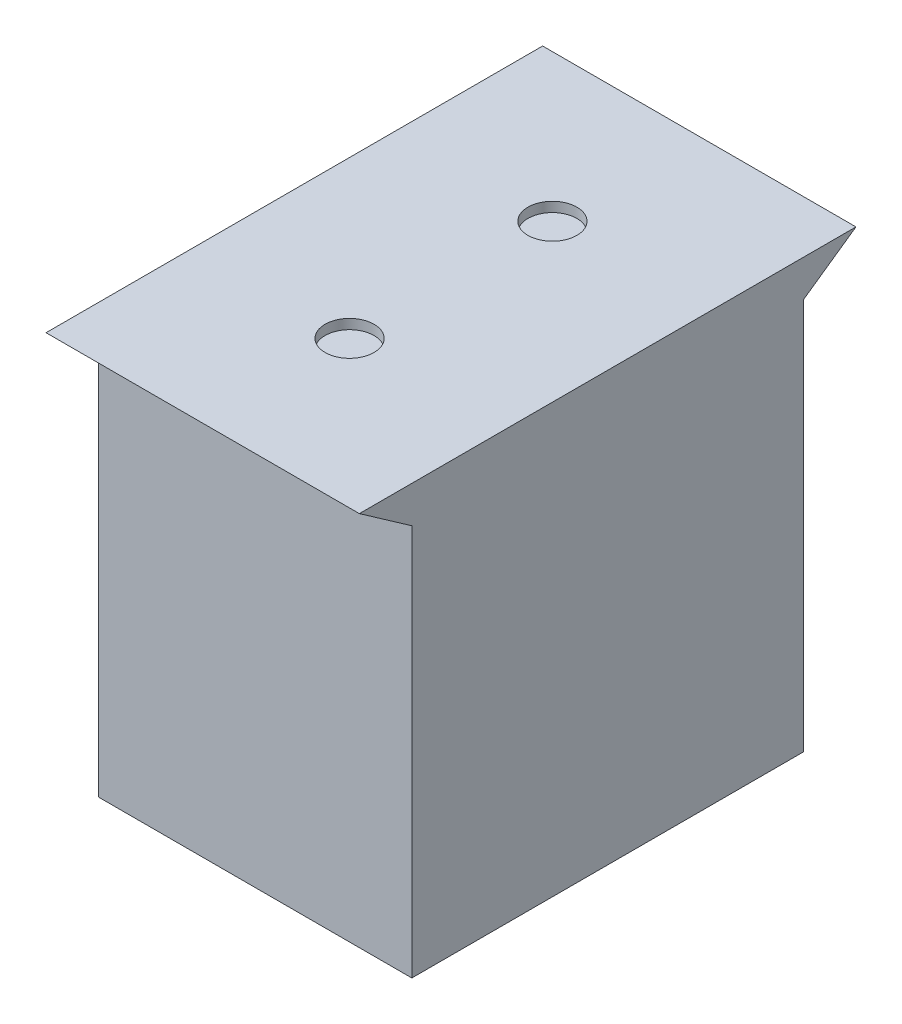
ISO-10303-21;
HEADER;
FILE_DESCRIPTION(('STEP AP214'),'2;1');
FILE_NAME('part.step','',(''),(''),'','','');
FILE_SCHEMA(('AUTOMOTIVE_DESIGN { 1 0 10303 214 1 1 1 1 }'));
ENDSEC;
DATA;
#1=APPLICATION_CONTEXT('core data for automotive mechanical design processes');
#2=APPLICATION_PROTOCOL_DEFINITION('international standard','automotive_design',2000,#1);
#3=PRODUCT_CONTEXT('',#1,'mechanical');
#4=PRODUCT('Part','Part','',(#3));
#5=PRODUCT_RELATED_PRODUCT_CATEGORY('part','',(#4));
#6=PRODUCT_DEFINITION_FORMATION('','',#4);
#7=PRODUCT_DEFINITION_CONTEXT('part definition',#1,'design');
#8=PRODUCT_DEFINITION('design','',#6,#7);
#9=PRODUCT_DEFINITION_SHAPE('','',#8);
#10=(LENGTH_UNIT() NAMED_UNIT(*) SI_UNIT(.MILLI.,.METRE.));
#11=(NAMED_UNIT(*) PLANE_ANGLE_UNIT() SI_UNIT($,.RADIAN.));
#12=(NAMED_UNIT(*) SI_UNIT($,.STERADIAN.) SOLID_ANGLE_UNIT());
#13=UNCERTAINTY_MEASURE_WITH_UNIT(LENGTH_MEASURE(1.E-05),#10,'distance_accuracy_value','');
#14=(GEOMETRIC_REPRESENTATION_CONTEXT(3) GLOBAL_UNCERTAINTY_ASSIGNED_CONTEXT((#13)) GLOBAL_UNIT_ASSIGNED_CONTEXT((#10,
#11,#12)) REPRESENTATION_CONTEXT('',''));
#15=CARTESIAN_POINT('',(0.,0.,0.));
#16=DIRECTION('',(0.,0.,1.));
#17=DIRECTION('',(1.,0.,0.));
#18=AXIS2_PLACEMENT_3D('',#15,#16,#17);
#19=CARTESIAN_POINT('',(8.49073353619236,5.5565366358729,-3.22056484666148));
#20=DIRECTION('',(0.,1.,0.));
#21=DIRECTION('',(0.,0.,1.));
#22=AXIS2_PLACEMENT_3D('',#19,#20,#21);
#23=PLANE('',#22);
#24=CARTESIAN_POINT('',(0.,5.5565366358729,1.31556484666148));
#25=DIRECTION('',(0.,-1.,0.));
#26=DIRECTION('',(0.,0.,-1.));
#27=AXIS2_PLACEMENT_3D('',#24,#25,#26);
#28=CIRCLE('',#27,0.3175);
#29=CARTESIAN_POINT('',(0.,5.5565366358729,0.99806484666148));
#30=VERTEX_POINT('',#29);
#31=EDGE_CURVE('E218',#30,#30,#28,.T.);
#32=ORIENTED_EDGE('',*,*,#31,.T.);
#33=EDGE_LOOP('',(#32));
#34=FACE_BOUND('',#33,.T.);
#35=DIRECTION('',(0.,0.,1.));
#36=VECTOR('',#35,1.);
#37=CARTESIAN_POINT('',(2.032,5.5565366358729,-3.22056484666148));
#38=LINE('',#37,#36);
#39=CARTESIAN_POINT('',(2.032,5.5565366358729,-3.22056484666148));
#40=VERTEX_POINT('',#39);
#41=CARTESIAN_POINT('',(2.032,5.5565366358729,3.22056484666149));
#42=VERTEX_POINT('',#41);
#43=EDGE_CURVE('E147',#40,#42,#38,.T.);
#44=ORIENTED_EDGE('',*,*,#43,.F.);
#45=DIRECTION('',(-1.,0.,0.));
#46=VECTOR('',#45,1.);
#47=CARTESIAN_POINT('',(8.49073353619236,5.5565366358729,-3.22056484666148));
#48=LINE('',#47,#46);
#49=CARTESIAN_POINT('',(-2.032,5.5565366358729,-3.22056484666148));
#50=VERTEX_POINT('',#49);
#51=EDGE_CURVE('E121',#40,#50,#48,.T.);
#52=ORIENTED_EDGE('',*,*,#51,.T.);
#53=DIRECTION('',(0.,0.,-1.));
#54=VECTOR('',#53,1.);
#55=CARTESIAN_POINT('',(-2.032,5.5565366358729,-3.22056484666148));
#56=LINE('',#55,#54);
#57=CARTESIAN_POINT('',(-2.032,5.5565366358729,3.22056484666149));
#58=VERTEX_POINT('',#57);
#59=EDGE_CURVE('E125',#58,#50,#56,.T.);
#60=ORIENTED_EDGE('',*,*,#59,.F.);
#61=DIRECTION('',(-1.,0.,0.));
#62=VECTOR('',#61,1.);
#63=CARTESIAN_POINT('',(8.49073353619236,5.5565366358729,3.22056484666149));
#64=LINE('',#63,#62);
#65=EDGE_CURVE('E111',#42,#58,#64,.T.);
#66=ORIENTED_EDGE('',*,*,#65,.F.);
#67=EDGE_LOOP('',(#44,#52,#60,#66));
#68=FACE_BOUND('',#67,.T.);
#69=CARTESIAN_POINT('',(0.,5.5565366358729,-1.31556484666148));
#70=DIRECTION('',(0.,1.,0.));
#71=DIRECTION('',(0.,0.,1.));
#72=AXIS2_PLACEMENT_3D('',#69,#70,#71);
#73=CIRCLE('',#72,0.3175);
#74=CARTESIAN_POINT('',(0.,5.5565366358729,-0.998064846661482));
#75=VERTEX_POINT('',#74);
#76=EDGE_CURVE('E138',#75,#75,#73,.T.);
#77=ORIENTED_EDGE('',*,*,#76,.F.);
#78=EDGE_LOOP('',(#77));
#79=FACE_BOUND('',#78,.T.);
#80=ADVANCED_FACE('F48',(#34,#68,#79),#23,.T.);
#81=CARTESIAN_POINT('',(2.032,5.08,-2.54));
#82=DIRECTION('',(-1.,0.,0.));
#83=DIRECTION('',(0.,0.,1.));
#84=AXIS2_PLACEMENT_3D('',#81,#82,#83);
#85=PLANE('',#84);
#86=DIRECTION('',(0.,0.,-1.));
#87=VECTOR('',#86,1.);
#88=CARTESIAN_POINT('',(2.032,0.,-2.54));
#89=LINE('',#88,#87);
#90=CARTESIAN_POINT('',(2.032,0.,2.54));
#91=VERTEX_POINT('',#90);
#92=CARTESIAN_POINT('',(2.032,0.,-2.54));
#93=VERTEX_POINT('',#92);
#94=EDGE_CURVE('E151',#91,#93,#89,.T.);
#95=ORIENTED_EDGE('',*,*,#94,.T.);
#96=DIRECTION('',(0.,-1.,0.));
#97=VECTOR('',#96,1.);
#98=CARTESIAN_POINT('',(2.032,5.08,-2.54));
#99=LINE('',#98,#97);
#100=CARTESIAN_POINT('',(2.032,5.08,-2.54));
#101=VERTEX_POINT('',#100);
#102=EDGE_CURVE('E11',#101,#93,#99,.T.);
#103=ORIENTED_EDGE('',*,*,#102,.F.);
#104=DIRECTION('',(0.,0.573576436351041,-0.819152044288996));
#105=VECTOR('',#104,1.);
#106=CARTESIAN_POINT('',(2.032,5.08,-2.54));
#107=LINE('',#106,#105);
#108=EDGE_CURVE('E141',#101,#40,#107,.T.);
#109=ORIENTED_EDGE('',*,*,#108,.T.);
#110=ORIENTED_EDGE('',*,*,#43,.T.);
#111=DIRECTION('',(0.,-0.573576436351041,-0.819152044288995));
#112=VECTOR('',#111,1.);
#113=CARTESIAN_POINT('',(2.032,5.5565366358729,3.22056484666149));
#114=LINE('',#113,#112);
#115=CARTESIAN_POINT('',(2.032,5.08,2.54));
#116=VERTEX_POINT('',#115);
#117=EDGE_CURVE('E117',#42,#116,#114,.T.);
#118=ORIENTED_EDGE('',*,*,#117,.T.);
#119=DIRECTION('',(0.,-1.,0.));
#120=VECTOR('',#119,1.);
#121=CARTESIAN_POINT('',(2.032,5.08,2.54));
#122=LINE('',#121,#120);
#123=EDGE_CURVE('E157',#116,#91,#122,.T.);
#124=ORIENTED_EDGE('',*,*,#123,.T.);
#125=EDGE_LOOP('',(#95,#103,#109,#110,#118,#124));
#126=FACE_BOUND('',#125,.T.);
#127=ADVANCED_FACE('F50',(#126),#85,.F.);
#128=CARTESIAN_POINT('',(-2.032,5.08,-2.54));
#129=DIRECTION('',(0.,0.,1.));
#130=DIRECTION('',(1.,0.,0.));
#131=AXIS2_PLACEMENT_3D('',#128,#129,#130);
#132=PLANE('',#131);
#133=DIRECTION('',(-1.,0.,0.));
#134=VECTOR('',#133,1.);
#135=CARTESIAN_POINT('',(-2.032,0.,-2.54));
#136=LINE('',#135,#134);
#137=CARTESIAN_POINT('',(-2.032,0.,-2.54));
#138=VERTEX_POINT('',#137);
#139=EDGE_CURVE('E161',#93,#138,#136,.T.);
#140=ORIENTED_EDGE('',*,*,#139,.T.);
#141=DIRECTION('',(0.,-1.,0.));
#142=VECTOR('',#141,1.);
#143=CARTESIAN_POINT('',(-2.032,5.08,-2.54));
#144=LINE('',#143,#142);
#145=CARTESIAN_POINT('',(-2.032,5.08,-2.54));
#146=VERTEX_POINT('',#145);
#147=EDGE_CURVE('E58',#146,#138,#144,.T.);
#148=ORIENTED_EDGE('',*,*,#147,.F.);
#149=DIRECTION('',(-1.,0.,0.));
#150=VECTOR('',#149,1.);
#151=CARTESIAN_POINT('',(-2.032,5.08,-2.54));
#152=LINE('',#151,#150);
#153=EDGE_CURVE('E92',#101,#146,#152,.T.);
#154=ORIENTED_EDGE('',*,*,#153,.F.);
#155=ORIENTED_EDGE('',*,*,#102,.T.);
#156=EDGE_LOOP('',(#140,#148,#154,#155));
#157=FACE_BOUND('',#156,.T.);
#158=ADVANCED_FACE('F186',(#157),#132,.F.);
#159=CARTESIAN_POINT('',(-2.032,5.08,-2.54));
#160=DIRECTION('',(1.,0.,0.));
#161=DIRECTION('',(0.,0.,-1.));
#162=AXIS2_PLACEMENT_3D('',#159,#160,#161);
#163=PLANE('',#162);
#164=DIRECTION('',(0.,0.,1.));
#165=VECTOR('',#164,1.);
#166=CARTESIAN_POINT('',(-2.032,0.,-2.54));
#167=LINE('',#166,#165);
#168=CARTESIAN_POINT('',(-2.032,0.,2.54));
#169=VERTEX_POINT('',#168);
#170=EDGE_CURVE('E82',#138,#169,#167,.T.);
#171=ORIENTED_EDGE('',*,*,#170,.T.);
#172=DIRECTION('',(0.,-1.,0.));
#173=VECTOR('',#172,1.);
#174=CARTESIAN_POINT('',(-2.032,5.08,2.54));
#175=LINE('',#174,#173);
#176=CARTESIAN_POINT('',(-2.032,5.08,2.54));
#177=VERTEX_POINT('',#176);
#178=EDGE_CURVE('E66',#177,#169,#175,.T.);
#179=ORIENTED_EDGE('',*,*,#178,.F.);
#180=DIRECTION('',(0.,0.573576436351041,0.819152044288995));
#181=VECTOR('',#180,1.);
#182=CARTESIAN_POINT('',(-2.032,5.5565366358729,3.22056484666149));
#183=LINE('',#182,#181);
#184=EDGE_CURVE('E115',#177,#58,#183,.T.);
#185=ORIENTED_EDGE('',*,*,#184,.T.);
#186=ORIENTED_EDGE('',*,*,#59,.T.);
#187=DIRECTION('',(0.,-0.573576436351041,0.819152044288995));
#188=VECTOR('',#187,1.);
#189=CARTESIAN_POINT('',(-2.032,5.08,-2.54));
#190=LINE('',#189,#188);
#191=EDGE_CURVE('E122',#50,#146,#190,.T.);
#192=ORIENTED_EDGE('',*,*,#191,.T.);
#193=ORIENTED_EDGE('',*,*,#147,.T.);
#194=EDGE_LOOP('',(#171,#179,#185,#186,#192,#193));
#195=FACE_BOUND('',#194,.T.);
#196=ADVANCED_FACE('F132',(#195),#163,.F.);
#197=CARTESIAN_POINT('',(-2.032,5.08,2.54));
#198=DIRECTION('',(0.,0.,-1.));
#199=DIRECTION('',(-1.,0.,0.));
#200=AXIS2_PLACEMENT_3D('',#197,#198,#199);
#201=PLANE('',#200);
#202=DIRECTION('',(1.,0.,0.));
#203=VECTOR('',#202,1.);
#204=CARTESIAN_POINT('',(-2.032,0.,2.54));
#205=LINE('',#204,#203);
#206=EDGE_CURVE('E87',#169,#91,#205,.T.);
#207=ORIENTED_EDGE('',*,*,#206,.T.);
#208=ORIENTED_EDGE('',*,*,#123,.F.);
#209=DIRECTION('',(1.,0.,0.));
#210=VECTOR('',#209,1.);
#211=CARTESIAN_POINT('',(-2.032,5.08,2.54));
#212=LINE('',#211,#210);
#213=EDGE_CURVE('E154',#177,#116,#212,.T.);
#214=ORIENTED_EDGE('',*,*,#213,.F.);
#215=ORIENTED_EDGE('',*,*,#178,.T.);
#216=EDGE_LOOP('',(#207,#208,#214,#215));
#217=FACE_BOUND('',#216,.T.);
#218=ADVANCED_FACE('F177',(#217),#201,.F.);
#219=CARTESIAN_POINT('',(0.,0.,0.));
#220=DIRECTION('',(0.,1.,0.));
#221=DIRECTION('',(0.,0.,1.));
#222=AXIS2_PLACEMENT_3D('',#219,#220,#221);
#223=PLANE('',#222);
#224=ORIENTED_EDGE('',*,*,#94,.F.);
#225=ORIENTED_EDGE('',*,*,#206,.F.);
#226=ORIENTED_EDGE('',*,*,#170,.F.);
#227=ORIENTED_EDGE('',*,*,#139,.F.);
#228=EDGE_LOOP('',(#224,#225,#226,#227));
#229=FACE_BOUND('',#228,.T.);
#230=ADVANCED_FACE('F174',(#229),#223,.F.);
#231=CARTESIAN_POINT('',(8.49073353619236,5.08,-2.54));
#232=DIRECTION('',(0.,-0.819152044288995,-0.573576436351041));
#233=DIRECTION('',(0.,0.573576436351041,-0.819152044288996));
#234=AXIS2_PLACEMENT_3D('',#231,#232,#233);
#235=PLANE('',#234);
#236=ORIENTED_EDGE('',*,*,#108,.F.);
#237=ORIENTED_EDGE('',*,*,#153,.T.);
#238=ORIENTED_EDGE('',*,*,#191,.F.);
#239=ORIENTED_EDGE('',*,*,#51,.F.);
#240=EDGE_LOOP('',(#236,#237,#238,#239));
#241=FACE_BOUND('',#240,.T.);
#242=ADVANCED_FACE('F184',(#241),#235,.T.);
#243=CARTESIAN_POINT('',(8.49073353619236,5.5565366358729,3.22056484666149));
#244=DIRECTION('',(0.,-0.819152044288995,0.573576436351041));
#245=DIRECTION('',(0.,-0.573576436351041,-0.819152044288995));
#246=AXIS2_PLACEMENT_3D('',#243,#244,#245);
#247=PLANE('',#246);
#248=ORIENTED_EDGE('',*,*,#117,.F.);
#249=ORIENTED_EDGE('',*,*,#65,.T.);
#250=ORIENTED_EDGE('',*,*,#184,.F.);
#251=ORIENTED_EDGE('',*,*,#213,.T.);
#252=EDGE_LOOP('',(#248,#249,#250,#251));
#253=FACE_BOUND('',#252,.T.);
#254=ADVANCED_FACE('F113',(#253),#247,.T.);
#255=CARTESIAN_POINT('',(0.,5.4295366358729,1.31556484666148));
#256=DIRECTION('',(0.,1.,0.));
#257=DIRECTION('',(0.,0.,1.));
#258=AXIS2_PLACEMENT_3D('',#255,#256,#257);
#259=CYLINDRICAL_SURFACE('',#258,0.3175);
#260=CARTESIAN_POINT('',(0.,5.4295366358729,1.31556484666148));
#261=DIRECTION('',(0.,-1.,0.));
#262=DIRECTION('',(0.,0.,-1.));
#263=AXIS2_PLACEMENT_3D('',#260,#261,#262);
#264=CIRCLE('',#263,0.3175);
#265=CARTESIAN_POINT('',(0.,5.4295366358729,0.99806484666148));
#266=VERTEX_POINT('',#265);
#267=EDGE_CURVE('E214',#266,#266,#264,.T.);
#268=ORIENTED_EDGE('',*,*,#267,.T.);
#269=EDGE_LOOP('',(#268));
#270=FACE_BOUND('',#269,.T.);
#271=ORIENTED_EDGE('',*,*,#31,.F.);
#272=EDGE_LOOP('',(#271));
#273=FACE_BOUND('',#272,.T.);
#274=ADVANCED_FACE('F200',(#270,#273),#259,.F.);
#275=CARTESIAN_POINT('',(0.,5.4295366358729,1.31556484666148));
#276=DIRECTION('',(0.,-1.,0.));
#277=DIRECTION('',(0.,0.,-1.));
#278=AXIS2_PLACEMENT_3D('',#275,#276,#277);
#279=PLANE('',#278);
#280=ORIENTED_EDGE('',*,*,#267,.F.);
#281=EDGE_LOOP('',(#280));
#282=FACE_BOUND('',#281,.T.);
#283=ADVANCED_FACE('F204',(#282),#279,.F.);
#284=CARTESIAN_POINT('',(0.,5.4295366358729,-1.31556484666148));
#285=DIRECTION('',(0.,1.,0.));
#286=DIRECTION('',(0.,0.,1.));
#287=AXIS2_PLACEMENT_3D('',#284,#285,#286);
#288=CYLINDRICAL_SURFACE('',#287,0.3175);
#289=CARTESIAN_POINT('',(0.,5.4295366358729,-1.31556484666148));
#290=DIRECTION('',(0.,1.,0.));
#291=DIRECTION('',(0.,0.,1.));
#292=AXIS2_PLACEMENT_3D('',#289,#290,#291);
#293=CIRCLE('',#292,0.3175);
#294=CARTESIAN_POINT('',(0.,5.4295366358729,-0.998064846661482));
#295=VERTEX_POINT('',#294);
#296=EDGE_CURVE('E134',#295,#295,#293,.T.);
#297=ORIENTED_EDGE('',*,*,#296,.F.);
#298=EDGE_LOOP('',(#297));
#299=FACE_BOUND('',#298,.T.);
#300=ORIENTED_EDGE('',*,*,#76,.T.);
#301=EDGE_LOOP('',(#300));
#302=FACE_BOUND('',#301,.T.);
#303=ADVANCED_FACE('F225',(#299,#302),#288,.F.);
#304=CARTESIAN_POINT('',(0.,5.4295366358729,-1.31556484666148));
#305=DIRECTION('',(0.,1.,0.));
#306=DIRECTION('',(0.,0.,1.));
#307=AXIS2_PLACEMENT_3D('',#304,#305,#306);
#308=PLANE('',#307);
#309=ORIENTED_EDGE('',*,*,#296,.T.);
#310=EDGE_LOOP('',(#309));
#311=FACE_BOUND('',#310,.T.);
#312=ADVANCED_FACE('F227',(#311),#308,.T.);
#313=CLOSED_SHELL('',(#80,#127,#158,#196,#218,#230,#242,#254,#274,#283,#303,#312));
#314=MANIFOLD_SOLID_BREP('B2',#313);
#315=ADVANCED_BREP_SHAPE_REPRESENTATION('',(#18,#314),#14);
#316=SHAPE_DEFINITION_REPRESENTATION(#9,#315);
ENDSEC;
END-ISO-10303-21;
